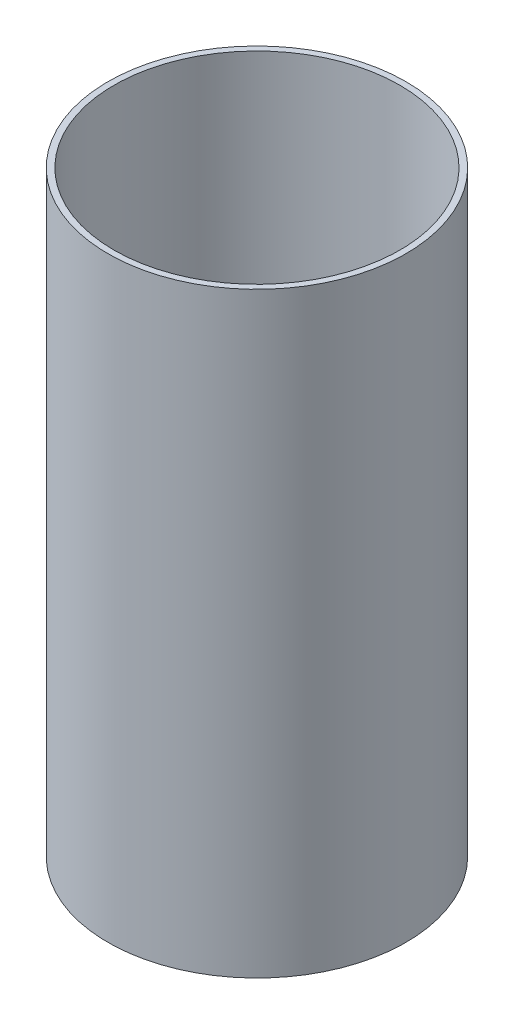
ISO-10303-21;
HEADER;
FILE_DESCRIPTION(('STEP AP214'),'2;1');
FILE_NAME('part.step','',(''),(''),'','','');
FILE_SCHEMA(('AUTOMOTIVE_DESIGN { 1 0 10303 214 1 1 1 1 }'));
ENDSEC;
DATA;
#1=APPLICATION_CONTEXT('core data for automotive mechanical design processes');
#2=APPLICATION_PROTOCOL_DEFINITION('international standard','automotive_design',2000,#1);
#3=PRODUCT_CONTEXT('',#1,'mechanical');
#4=PRODUCT('Part','Part','',(#3));
#5=PRODUCT_RELATED_PRODUCT_CATEGORY('part','',(#4));
#6=PRODUCT_DEFINITION_FORMATION('','',#4);
#7=PRODUCT_DEFINITION_CONTEXT('part definition',#1,'design');
#8=PRODUCT_DEFINITION('design','',#6,#7);
#9=PRODUCT_DEFINITION_SHAPE('','',#8);
#10=(LENGTH_UNIT() NAMED_UNIT(*) SI_UNIT(.MILLI.,.METRE.));
#11=(NAMED_UNIT(*) PLANE_ANGLE_UNIT() SI_UNIT($,.RADIAN.));
#12=(NAMED_UNIT(*) SI_UNIT($,.STERADIAN.) SOLID_ANGLE_UNIT());
#13=UNCERTAINTY_MEASURE_WITH_UNIT(LENGTH_MEASURE(1.E-05),#10,'distance_accuracy_value','');
#14=(GEOMETRIC_REPRESENTATION_CONTEXT(3) GLOBAL_UNCERTAINTY_ASSIGNED_CONTEXT((#13)) GLOBAL_UNIT_ASSIGNED_CONTEXT((#10,
#11,#12)) REPRESENTATION_CONTEXT('',''));
#15=CARTESIAN_POINT('',(0.,0.,0.));
#16=DIRECTION('',(0.,0.,1.));
#17=DIRECTION('',(1.,0.,0.));
#18=AXIS2_PLACEMENT_3D('',#15,#16,#17);
#19=CARTESIAN_POINT('',(0.,152.4,0.));
#20=DIRECTION('',(0.,1.,0.));
#21=DIRECTION('',(0.,0.,1.));
#22=AXIS2_PLACEMENT_3D('',#19,#20,#21);
#23=PLANE('',#22);
#24=CARTESIAN_POINT('',(0.,152.4,0.));
#25=DIRECTION('',(0.,1.,0.));
#26=DIRECTION('',(0.,0.,1.));
#27=AXIS2_PLACEMENT_3D('',#24,#25,#26);
#28=CIRCLE('',#27,38.0746);
#29=CARTESIAN_POINT('',(0.,152.4,-38.0746));
#30=VERTEX_POINT('',#29);
#31=EDGE_CURVE('E10',#30,#30,#28,.T.);
#32=ORIENTED_EDGE('',*,*,#31,.T.);
#33=EDGE_LOOP('',(#32));
#34=FACE_BOUND('',#33,.T.);
#35=CARTESIAN_POINT('',(0.,152.4,0.));
#36=DIRECTION('',(0.,1.,0.));
#37=DIRECTION('',(0.,0.,1.));
#38=AXIS2_PLACEMENT_3D('',#35,#36,#37);
#39=CIRCLE('',#38,36.5125);
#40=CARTESIAN_POINT('',(0.,152.4,-36.5125));
#41=VERTEX_POINT('',#40);
#42=EDGE_CURVE('E56',#41,#41,#39,.T.);
#43=ORIENTED_EDGE('',*,*,#42,.F.);
#44=EDGE_LOOP('',(#43));
#45=FACE_BOUND('',#44,.T.);
#46=ADVANCED_FACE('F43',(#34,#45),#23,.T.);
#47=CARTESIAN_POINT('',(0.,0.,0.));
#48=DIRECTION('',(0.,1.,0.));
#49=DIRECTION('',(0.,0.,1.));
#50=AXIS2_PLACEMENT_3D('',#47,#48,#49);
#51=PLANE('',#50);
#52=CARTESIAN_POINT('',(0.,0.,0.));
#53=DIRECTION('',(0.,1.,0.));
#54=DIRECTION('',(0.,0.,1.));
#55=AXIS2_PLACEMENT_3D('',#52,#53,#54);
#56=CIRCLE('',#55,38.0746);
#57=CARTESIAN_POINT('',(0.,0.,-38.0746));
#58=VERTEX_POINT('',#57);
#59=EDGE_CURVE('E47',#58,#58,#56,.T.);
#60=ORIENTED_EDGE('',*,*,#59,.F.);
#61=EDGE_LOOP('',(#60));
#62=FACE_BOUND('',#61,.T.);
#63=CARTESIAN_POINT('',(0.,0.,0.));
#64=DIRECTION('',(0.,1.,0.));
#65=DIRECTION('',(0.,0.,1.));
#66=AXIS2_PLACEMENT_3D('',#63,#64,#65);
#67=CIRCLE('',#66,36.5125);
#68=CARTESIAN_POINT('',(0.,0.,-36.5125));
#69=VERTEX_POINT('',#68);
#70=EDGE_CURVE('E58',#69,#69,#67,.T.);
#71=ORIENTED_EDGE('',*,*,#70,.T.);
#72=EDGE_LOOP('',(#71));
#73=FACE_BOUND('',#72,.T.);
#74=ADVANCED_FACE('F70',(#62,#73),#51,.F.);
#75=CARTESIAN_POINT('',(0.,152.4,0.));
#76=DIRECTION('',(0.,-1.,0.));
#77=DIRECTION('',(0.,0.,-1.));
#78=AXIS2_PLACEMENT_3D('',#75,#76,#77);
#79=CYLINDRICAL_SURFACE('',#78,38.0746);
#80=CARTESIAN_POINT('',(0.,152.4,-38.0746));
#81=CARTESIAN_POINT('',(0.,150.8125,-38.0746));
#82=CARTESIAN_POINT('',(0.,149.225,-38.0746));
#83=CARTESIAN_POINT('',(0.,146.05,-38.0746));
#84=CARTESIAN_POINT('',(0.,144.4625,-38.0746));
#85=CARTESIAN_POINT('',(0.,141.2875,-38.0746));
#86=CARTESIAN_POINT('',(0.,139.7,-38.0746));
#87=CARTESIAN_POINT('',(0.,136.525,-38.0746));
#88=CARTESIAN_POINT('',(0.,134.9375,-38.0746));
#89=CARTESIAN_POINT('',(0.,131.7625,-38.0746));
#90=CARTESIAN_POINT('',(0.,130.175,-38.0746));
#91=CARTESIAN_POINT('',(0.,127.,-38.0746));
#92=CARTESIAN_POINT('',(0.,125.4125,-38.0746));
#93=CARTESIAN_POINT('',(0.,122.2375,-38.0746));
#94=CARTESIAN_POINT('',(0.,120.65,-38.0746));
#95=CARTESIAN_POINT('',(0.,117.475,-38.0746));
#96=CARTESIAN_POINT('',(0.,115.8875,-38.0746));
#97=CARTESIAN_POINT('',(0.,112.7125,-38.0746));
#98=CARTESIAN_POINT('',(0.,111.125,-38.0746));
#99=CARTESIAN_POINT('',(0.,107.95,-38.0746));
#100=CARTESIAN_POINT('',(0.,106.3625,-38.0746));
#101=CARTESIAN_POINT('',(0.,103.1875,-38.0746));
#102=CARTESIAN_POINT('',(0.,101.6,-38.0746));
#103=CARTESIAN_POINT('',(0.,98.425,-38.0746));
#104=CARTESIAN_POINT('',(0.,96.8375,-38.0746));
#105=CARTESIAN_POINT('',(0.,93.6625,-38.0746));
#106=CARTESIAN_POINT('',(0.,92.075,-38.0746));
#107=CARTESIAN_POINT('',(0.,88.9,-38.0746));
#108=CARTESIAN_POINT('',(0.,87.3125,-38.0746));
#109=CARTESIAN_POINT('',(0.,84.1375,-38.0746));
#110=CARTESIAN_POINT('',(0.,82.55,-38.0746));
#111=CARTESIAN_POINT('',(0.,79.375,-38.0746));
#112=CARTESIAN_POINT('',(0.,77.7875,-38.0746));
#113=CARTESIAN_POINT('',(0.,74.6125,-38.0746));
#114=CARTESIAN_POINT('',(0.,73.025,-38.0746));
#115=CARTESIAN_POINT('',(0.,69.85,-38.0746));
#116=CARTESIAN_POINT('',(0.,68.2625,-38.0746));
#117=CARTESIAN_POINT('',(0.,65.0875,-38.0746));
#118=CARTESIAN_POINT('',(0.,63.5,-38.0746));
#119=CARTESIAN_POINT('',(0.,60.325,-38.0746));
#120=CARTESIAN_POINT('',(0.,58.7375,-38.0746));
#121=CARTESIAN_POINT('',(0.,55.5625,-38.0746));
#122=CARTESIAN_POINT('',(0.,53.975,-38.0746));
#123=CARTESIAN_POINT('',(0.,50.8,-38.0746));
#124=CARTESIAN_POINT('',(0.,49.2125,-38.0746));
#125=CARTESIAN_POINT('',(0.,46.0375,-38.0746));
#126=CARTESIAN_POINT('',(0.,44.45,-38.0746));
#127=CARTESIAN_POINT('',(0.,41.275,-38.0746));
#128=CARTESIAN_POINT('',(0.,39.6875,-38.0746));
#129=CARTESIAN_POINT('',(0.,36.5125,-38.0746));
#130=CARTESIAN_POINT('',(0.,34.925,-38.0746));
#131=CARTESIAN_POINT('',(0.,31.75,-38.0746));
#132=CARTESIAN_POINT('',(0.,30.1625,-38.0746));
#133=CARTESIAN_POINT('',(0.,26.9875,-38.0746));
#134=CARTESIAN_POINT('',(0.,25.4,-38.0746));
#135=CARTESIAN_POINT('',(0.,22.225,-38.0746));
#136=CARTESIAN_POINT('',(0.,20.6375,-38.0746));
#137=CARTESIAN_POINT('',(0.,17.4625,-38.0746));
#138=CARTESIAN_POINT('',(0.,15.875,-38.0746));
#139=CARTESIAN_POINT('',(0.,12.7,-38.0746));
#140=CARTESIAN_POINT('',(0.,11.1125,-38.0746));
#141=CARTESIAN_POINT('',(0.,7.93750000000001,-38.0746));
#142=CARTESIAN_POINT('',(0.,6.35,-38.0746));
#143=CARTESIAN_POINT('',(0.,3.175,-38.0746));
#144=CARTESIAN_POINT('',(0.,1.5875,-38.0746));
#145=CARTESIAN_POINT('',(0.,0.,-38.0746));
#146=B_SPLINE_CURVE_WITH_KNOTS('',3,(#80,#81,#82,#83,#84,#85,#86,#87,#88,#89,#90,#91,#92,#93,
#94,#95,#96,#97,#98,#99,#100,#101,#102,#103,#104,#105,#106,#107,#108,#109,#110,#111,#112,#113,
#114,#115,#116,#117,#118,#119,#120,#121,#122,#123,#124,#125,#126,#127,#128,#129,#130,#131,#132,
#133,#134,#135,#136,#137,#138,#139,#140,#141,#142,#143,#144,#145),.UNSPECIFIED.,.F.,.F.,(4,2,2,
2,2,2,2,2,2,2,2,2,2,2,2,2,2,2,2,2,2,2,2,2,2,2,2,2,2,2,2,2,4),(0.,4.7625,9.52500000000001,
14.2875,19.05,23.8125,28.575,33.3375,38.1,42.8625,47.625,52.3875,57.15,61.9125,66.675,71.4375,
76.2,80.9625,85.725,90.4875,95.25,100.0125,104.775,109.5375,114.3,119.0625,123.825,128.5875,
133.35,138.1125,142.875,147.6375,152.4),.UNSPECIFIED.);
#147=EDGE_CURVE('BSEAM45',#30,#58,#146,.T.);
#148=ORIENTED_EDGE('',*,*,#31,.F.);
#149=ORIENTED_EDGE('',*,*,#59,.T.);
#150=ORIENTED_EDGE('',*,*,#147,.T.);
#151=ORIENTED_EDGE('',*,*,#147,.F.);
#152=EDGE_LOOP('',(#148,#150,#149,#151));
#153=FACE_BOUND('',#152,.T.);
#154=ADVANCED_FACE('F45',(#153),#79,.T.);
#155=CARTESIAN_POINT('',(0.,152.4,0.));
#156=DIRECTION('',(0.,-1.,0.));
#157=DIRECTION('',(0.,0.,-1.));
#158=AXIS2_PLACEMENT_3D('',#155,#156,#157);
#159=CYLINDRICAL_SURFACE('',#158,36.5125);
#160=CARTESIAN_POINT('',(0.,152.4,-36.5125));
#161=CARTESIAN_POINT('',(0.,150.8125,-36.5125));
#162=CARTESIAN_POINT('',(0.,149.225,-36.5125));
#163=CARTESIAN_POINT('',(0.,146.05,-36.5125));
#164=CARTESIAN_POINT('',(0.,144.4625,-36.5125));
#165=CARTESIAN_POINT('',(0.,141.2875,-36.5125));
#166=CARTESIAN_POINT('',(0.,139.7,-36.5125));
#167=CARTESIAN_POINT('',(0.,136.525,-36.5125));
#168=CARTESIAN_POINT('',(0.,134.9375,-36.5125));
#169=CARTESIAN_POINT('',(0.,131.7625,-36.5125));
#170=CARTESIAN_POINT('',(0.,130.175,-36.5125));
#171=CARTESIAN_POINT('',(0.,127.,-36.5125));
#172=CARTESIAN_POINT('',(0.,125.4125,-36.5125));
#173=CARTESIAN_POINT('',(0.,122.2375,-36.5125));
#174=CARTESIAN_POINT('',(0.,120.65,-36.5125));
#175=CARTESIAN_POINT('',(0.,117.475,-36.5125));
#176=CARTESIAN_POINT('',(0.,115.8875,-36.5125));
#177=CARTESIAN_POINT('',(0.,112.7125,-36.5125));
#178=CARTESIAN_POINT('',(0.,111.125,-36.5125));
#179=CARTESIAN_POINT('',(0.,107.95,-36.5125));
#180=CARTESIAN_POINT('',(0.,106.3625,-36.5125));
#181=CARTESIAN_POINT('',(0.,103.1875,-36.5125));
#182=CARTESIAN_POINT('',(0.,101.6,-36.5125));
#183=CARTESIAN_POINT('',(0.,98.425,-36.5125));
#184=CARTESIAN_POINT('',(0.,96.8375,-36.5125));
#185=CARTESIAN_POINT('',(0.,93.6625,-36.5125));
#186=CARTESIAN_POINT('',(0.,92.075,-36.5125));
#187=CARTESIAN_POINT('',(0.,88.9,-36.5125));
#188=CARTESIAN_POINT('',(0.,87.3125,-36.5125));
#189=CARTESIAN_POINT('',(0.,84.1375,-36.5125));
#190=CARTESIAN_POINT('',(0.,82.55,-36.5125));
#191=CARTESIAN_POINT('',(0.,79.375,-36.5125));
#192=CARTESIAN_POINT('',(0.,77.7875,-36.5125));
#193=CARTESIAN_POINT('',(0.,74.6125,-36.5125));
#194=CARTESIAN_POINT('',(0.,73.025,-36.5125));
#195=CARTESIAN_POINT('',(0.,69.85,-36.5125));
#196=CARTESIAN_POINT('',(0.,68.2625,-36.5125));
#197=CARTESIAN_POINT('',(0.,65.0875,-36.5125));
#198=CARTESIAN_POINT('',(0.,63.5,-36.5125));
#199=CARTESIAN_POINT('',(0.,60.325,-36.5125));
#200=CARTESIAN_POINT('',(0.,58.7375,-36.5125));
#201=CARTESIAN_POINT('',(0.,55.5625,-36.5125));
#202=CARTESIAN_POINT('',(0.,53.975,-36.5125));
#203=CARTESIAN_POINT('',(0.,50.8,-36.5125));
#204=CARTESIAN_POINT('',(0.,49.2125,-36.5125));
#205=CARTESIAN_POINT('',(0.,46.0375,-36.5125));
#206=CARTESIAN_POINT('',(0.,44.45,-36.5125));
#207=CARTESIAN_POINT('',(0.,41.275,-36.5125));
#208=CARTESIAN_POINT('',(0.,39.6875,-36.5125));
#209=CARTESIAN_POINT('',(0.,36.5125,-36.5125));
#210=CARTESIAN_POINT('',(0.,34.925,-36.5125));
#211=CARTESIAN_POINT('',(0.,31.75,-36.5125));
#212=CARTESIAN_POINT('',(0.,30.1625,-36.5125));
#213=CARTESIAN_POINT('',(0.,26.9875,-36.5125));
#214=CARTESIAN_POINT('',(0.,25.4,-36.5125));
#215=CARTESIAN_POINT('',(0.,22.225,-36.5125));
#216=CARTESIAN_POINT('',(0.,20.6375,-36.5125));
#217=CARTESIAN_POINT('',(0.,17.4625,-36.5125));
#218=CARTESIAN_POINT('',(0.,15.875,-36.5125));
#219=CARTESIAN_POINT('',(0.,12.7,-36.5125));
#220=CARTESIAN_POINT('',(0.,11.1125,-36.5125));
#221=CARTESIAN_POINT('',(0.,7.93750000000001,-36.5125));
#222=CARTESIAN_POINT('',(0.,6.35,-36.5125));
#223=CARTESIAN_POINT('',(0.,3.175,-36.5125));
#224=CARTESIAN_POINT('',(0.,1.5875,-36.5125));
#225=CARTESIAN_POINT('',(0.,0.,-36.5125));
#226=B_SPLINE_CURVE_WITH_KNOTS('',3,(#160,#161,#162,#163,#164,#165,#166,#167,#168,#169,#170,
#171,#172,#173,#174,#175,#176,#177,#178,#179,#180,#181,#182,#183,#184,#185,#186,#187,#188,#189,
#190,#191,#192,#193,#194,#195,#196,#197,#198,#199,#200,#201,#202,#203,#204,#205,#206,#207,#208,
#209,#210,#211,#212,#213,#214,#215,#216,#217,#218,#219,#220,#221,#222,#223,#224,#225),
.UNSPECIFIED.,.F.,.F.,(4,2,2,2,2,2,2,2,2,2,2,2,2,2,2,2,2,2,2,2,2,2,2,2,2,2,2,2,2,2,2,2,4),(0.,
4.76249999999998,9.52499999999998,14.2875,19.05,23.8125,28.575,33.3375,38.1,42.8625,47.625,
52.3875,57.15,61.9125,66.675,71.4375,76.2,80.9625,85.725,90.4875,95.25,100.0125,104.775,
109.5375,114.3,119.0625,123.825,128.5875,133.35,138.1125,142.875,147.6375,152.4),.UNSPECIFIED.);
#227=EDGE_CURVE('BSEAM66',#41,#69,#226,.T.);
#228=ORIENTED_EDGE('',*,*,#42,.T.);
#229=ORIENTED_EDGE('',*,*,#70,.F.);
#230=ORIENTED_EDGE('',*,*,#227,.T.);
#231=ORIENTED_EDGE('',*,*,#227,.F.);
#232=EDGE_LOOP('',(#228,#230,#229,#231));
#233=FACE_BOUND('',#232,.T.);
#234=ADVANCED_FACE('F66',(#233),#159,.F.);
#235=CLOSED_SHELL('',(#46,#74,#154,#234));
#236=MANIFOLD_SOLID_BREP('B2',#235);
#237=ADVANCED_BREP_SHAPE_REPRESENTATION('',(#18,#236),#14);
#238=SHAPE_DEFINITION_REPRESENTATION(#9,#237);
ENDSEC;
END-ISO-10303-21;
